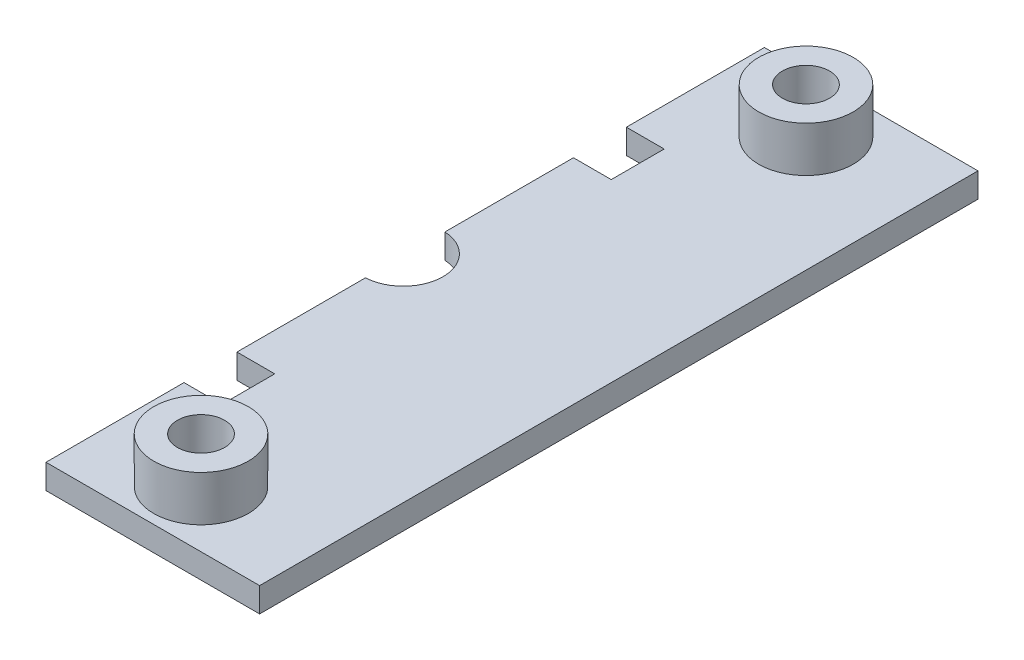
ISO-10303-21;
HEADER;
FILE_DESCRIPTION(('STEP AP214'),'2;1');
FILE_NAME('part.step','',(''),(''),'','','');
FILE_SCHEMA(('AUTOMOTIVE_DESIGN { 1 0 10303 214 1 1 1 1 }'));
ENDSEC;
DATA;
#1=APPLICATION_CONTEXT('core data for automotive mechanical design processes');
#2=APPLICATION_PROTOCOL_DEFINITION('international standard','automotive_design',2000,#1);
#3=PRODUCT_CONTEXT('',#1,'mechanical');
#4=PRODUCT('Part','Part','',(#3));
#5=PRODUCT_RELATED_PRODUCT_CATEGORY('part','',(#4));
#6=PRODUCT_DEFINITION_FORMATION('','',#4);
#7=PRODUCT_DEFINITION_CONTEXT('part definition',#1,'design');
#8=PRODUCT_DEFINITION('design','',#6,#7);
#9=PRODUCT_DEFINITION_SHAPE('','',#8);
#10=(LENGTH_UNIT() NAMED_UNIT(*) SI_UNIT(.MILLI.,.METRE.));
#11=(NAMED_UNIT(*) PLANE_ANGLE_UNIT() SI_UNIT($,.RADIAN.));
#12=(NAMED_UNIT(*) SI_UNIT($,.STERADIAN.) SOLID_ANGLE_UNIT());
#13=UNCERTAINTY_MEASURE_WITH_UNIT(LENGTH_MEASURE(1.E-05),#10,'distance_accuracy_value','');
#14=(GEOMETRIC_REPRESENTATION_CONTEXT(3) GLOBAL_UNCERTAINTY_ASSIGNED_CONTEXT((#13)) GLOBAL_UNIT_ASSIGNED_CONTEXT((#10,
#11,#12)) REPRESENTATION_CONTEXT('',''));
#15=CARTESIAN_POINT('',(0.,0.,0.));
#16=DIRECTION('',(0.,0.,1.));
#17=DIRECTION('',(1.,0.,0.));
#18=AXIS2_PLACEMENT_3D('',#15,#16,#17);
#19=CARTESIAN_POINT('',(-5.65,1.3,-19.));
#20=DIRECTION('',(1.,0.,0.));
#21=DIRECTION('',(0.,0.,-1.));
#22=AXIS2_PLACEMENT_3D('',#19,#20,#21);
#23=PLANE('',#22);
#24=DIRECTION('',(0.,0.,1.));
#25=VECTOR('',#24,1.);
#26=CARTESIAN_POINT('',(-5.65,0.,-19.));
#27=LINE('',#26,#25);
#28=CARTESIAN_POINT('',(-5.65,0.,-8.9));
#29=VERTEX_POINT('',#28);
#30=CARTESIAN_POINT('',(-5.65,0.,-2.1));
#31=VERTEX_POINT('',#30);
#32=EDGE_CURVE('E153',#29,#31,#27,.T.);
#33=ORIENTED_EDGE('',*,*,#32,.T.);
#34=DIRECTION('',(0.,1.,0.));
#35=VECTOR('',#34,1.);
#36=CARTESIAN_POINT('',(-5.65,0.,-2.1));
#37=LINE('',#36,#35);
#38=CARTESIAN_POINT('',(-5.65,1.3,-2.1));
#39=VERTEX_POINT('',#38);
#40=EDGE_CURVE('E47',#31,#39,#37,.T.);
#41=ORIENTED_EDGE('',*,*,#40,.T.);
#42=DIRECTION('',(0.,0.,1.));
#43=VECTOR('',#42,1.);
#44=CARTESIAN_POINT('',(-5.65,1.3,-19.));
#45=LINE('',#44,#43);
#46=CARTESIAN_POINT('',(-5.65,1.3,-8.9));
#47=VERTEX_POINT('',#46);
#48=EDGE_CURVE('E288',#47,#39,#45,.T.);
#49=ORIENTED_EDGE('',*,*,#48,.F.);
#50=DIRECTION('',(0.,1.,0.));
#51=VECTOR('',#50,1.);
#52=CARTESIAN_POINT('',(-5.65,0.,-8.9));
#53=LINE('',#52,#51);
#54=EDGE_CURVE('E263',#29,#47,#53,.T.);
#55=ORIENTED_EDGE('',*,*,#54,.F.);
#56=EDGE_LOOP('',(#33,#41,#49,#55));
#57=FACE_BOUND('',#56,.T.);
#58=ADVANCED_FACE('F32',(#57),#23,.F.);
#59=CARTESIAN_POINT('',(-5.65,1.3,2.1));
#60=VERTEX_POINT('',#59);
#61=CARTESIAN_POINT('',(-5.65,1.3,8.9));
#62=VERTEX_POINT('',#61);
#63=EDGE_CURVE('E147',#60,#62,#45,.T.);
#64=ORIENTED_EDGE('',*,*,#63,.F.);
#65=DIRECTION('',(0.,1.,0.));
#66=VECTOR('',#65,1.);
#67=CARTESIAN_POINT('',(-5.65,0.,2.1));
#68=LINE('',#67,#66);
#69=CARTESIAN_POINT('',(-5.65,0.,2.1));
#70=VERTEX_POINT('',#69);
#71=EDGE_CURVE('E133',#60,#70,#68,.F.);
#72=ORIENTED_EDGE('',*,*,#71,.T.);
#73=CARTESIAN_POINT('',(-5.65,0.,8.9));
#74=VERTEX_POINT('',#73);
#75=EDGE_CURVE('E145',#70,#74,#27,.T.);
#76=ORIENTED_EDGE('',*,*,#75,.T.);
#77=DIRECTION('',(0.,1.,0.));
#78=VECTOR('',#77,1.);
#79=CARTESIAN_POINT('',(-5.65,0.,8.9));
#80=LINE('',#79,#78);
#81=EDGE_CURVE('E275',#74,#62,#80,.T.);
#82=ORIENTED_EDGE('',*,*,#81,.T.);
#83=EDGE_LOOP('',(#64,#72,#76,#82));
#84=FACE_BOUND('',#83,.T.);
#85=ADVANCED_FACE('F143',(#84),#23,.F.);
#86=DIRECTION('',(0.,1.,0.));
#87=VECTOR('',#86,1.);
#88=CARTESIAN_POINT('',(-5.65,0.,11.7));
#89=LINE('',#88,#87);
#90=CARTESIAN_POINT('',(-5.65,0.,11.7));
#91=VERTEX_POINT('',#90);
#92=CARTESIAN_POINT('',(-5.65,1.3,11.7));
#93=VERTEX_POINT('',#92);
#94=EDGE_CURVE('E297',#91,#93,#89,.T.);
#95=ORIENTED_EDGE('',*,*,#94,.F.);
#96=CARTESIAN_POINT('',(-5.65,0.,19.));
#97=VERTEX_POINT('',#96);
#98=EDGE_CURVE('E154',#91,#97,#27,.T.);
#99=ORIENTED_EDGE('',*,*,#98,.T.);
#100=DIRECTION('',(0.,-1.,0.));
#101=VECTOR('',#100,1.);
#102=CARTESIAN_POINT('',(-5.65,1.3,19.));
#103=LINE('',#102,#101);
#104=CARTESIAN_POINT('',(-5.65,1.3,19.));
#105=VERTEX_POINT('',#104);
#106=EDGE_CURVE('E178',#105,#97,#103,.T.);
#107=ORIENTED_EDGE('',*,*,#106,.F.);
#108=EDGE_CURVE('E286',#93,#105,#45,.T.);
#109=ORIENTED_EDGE('',*,*,#108,.F.);
#110=EDGE_LOOP('',(#95,#99,#107,#109));
#111=FACE_BOUND('',#110,.T.);
#112=ADVANCED_FACE('F209',(#111),#23,.F.);
#113=CARTESIAN_POINT('',(0.,1.3,0.));
#114=DIRECTION('',(0.,1.,0.));
#115=DIRECTION('',(0.,0.,1.));
#116=AXIS2_PLACEMENT_3D('',#113,#114,#115);
#117=PLANE('',#116);
#118=CARTESIAN_POINT('',(-0.450000000000003,1.3,16.));
#119=DIRECTION('',(0.,1.,0.));
#120=DIRECTION('',(0.,0.,1.));
#121=AXIS2_PLACEMENT_3D('',#118,#119,#120);
#122=CIRCLE('',#121,2.5);
#123=CARTESIAN_POINT('',(-0.450000000000003,1.3,18.5));
#124=VERTEX_POINT('',#123);
#125=EDGE_CURVE('E11',#124,#124,#122,.T.);
#126=ORIENTED_EDGE('',*,*,#125,.F.);
#127=EDGE_LOOP('',(#126));
#128=FACE_BOUND('',#127,.T.);
#129=CARTESIAN_POINT('',(-0.450000000000003,1.3,-16.));
#130=DIRECTION('',(0.,1.,0.));
#131=DIRECTION('',(0.,0.,1.));
#132=AXIS2_PLACEMENT_3D('',#129,#130,#131);
#133=CIRCLE('',#132,2.5);
#134=CARTESIAN_POINT('',(-0.450000000000003,1.3,-13.5));
#135=VERTEX_POINT('',#134);
#136=EDGE_CURVE('E378',#135,#135,#133,.T.);
#137=ORIENTED_EDGE('',*,*,#136,.F.);
#138=EDGE_LOOP('',(#137));
#139=FACE_BOUND('',#138,.T.);
#140=CARTESIAN_POINT('',(-5.7525,1.3,0.));
#141=DIRECTION('',(0.,1.,0.));
#142=DIRECTION('',(0.,0.,1.));
#143=AXIS2_PLACEMENT_3D('',#140,#141,#142);
#144=CIRCLE('',#143,2.1025);
#145=EDGE_CURVE('E139',#60,#39,#144,.T.);
#146=ORIENTED_EDGE('',*,*,#145,.F.);
#147=ORIENTED_EDGE('',*,*,#63,.T.);
#148=DIRECTION('',(1.,0.,0.));
#149=VECTOR('',#148,1.);
#150=CARTESIAN_POINT('',(-5.65,1.3,8.9));
#151=LINE('',#150,#149);
#152=CARTESIAN_POINT('',(-3.65,1.3,8.9));
#153=VERTEX_POINT('',#152);
#154=EDGE_CURVE('E314',#62,#153,#151,.T.);
#155=ORIENTED_EDGE('',*,*,#154,.T.);
#156=DIRECTION('',(0.,0.,1.));
#157=VECTOR('',#156,1.);
#158=CARTESIAN_POINT('',(-3.65,1.3,11.7));
#159=LINE('',#158,#157);
#160=CARTESIAN_POINT('',(-3.65,1.3,11.7));
#161=VERTEX_POINT('',#160);
#162=EDGE_CURVE('E308',#153,#161,#159,.T.);
#163=ORIENTED_EDGE('',*,*,#162,.T.);
#164=DIRECTION('',(-1.,0.,0.));
#165=VECTOR('',#164,1.);
#166=CARTESIAN_POINT('',(-5.65,1.3,11.7));
#167=LINE('',#166,#165);
#168=EDGE_CURVE('E301',#161,#93,#167,.T.);
#169=ORIENTED_EDGE('',*,*,#168,.T.);
#170=ORIENTED_EDGE('',*,*,#108,.T.);
#171=DIRECTION('',(1.,0.,0.));
#172=VECTOR('',#171,1.);
#173=CARTESIAN_POINT('',(-5.65,1.3,19.));
#174=LINE('',#173,#172);
#175=CARTESIAN_POINT('',(5.65,1.3,19.));
#176=VERTEX_POINT('',#175);
#177=EDGE_CURVE('E179',#105,#176,#174,.T.);
#178=ORIENTED_EDGE('',*,*,#177,.T.);
#179=DIRECTION('',(0.,0.,-1.));
#180=VECTOR('',#179,1.);
#181=CARTESIAN_POINT('',(5.65,1.3,-19.));
#182=LINE('',#181,#180);
#183=CARTESIAN_POINT('',(5.65,1.3,-19.));
#184=VERTEX_POINT('',#183);
#185=EDGE_CURVE('E166',#176,#184,#182,.T.);
#186=ORIENTED_EDGE('',*,*,#185,.T.);
#187=DIRECTION('',(-1.,0.,0.));
#188=VECTOR('',#187,1.);
#189=CARTESIAN_POINT('',(-5.65,1.3,-19.));
#190=LINE('',#189,#188);
#191=CARTESIAN_POINT('',(-5.65,1.3,-19.));
#192=VERTEX_POINT('',#191);
#193=EDGE_CURVE('E173',#184,#192,#190,.T.);
#194=ORIENTED_EDGE('',*,*,#193,.T.);
#195=CARTESIAN_POINT('',(-5.65,1.3,-11.7));
#196=VERTEX_POINT('',#195);
#197=EDGE_CURVE('E256',#192,#196,#45,.T.);
#198=ORIENTED_EDGE('',*,*,#197,.T.);
#199=DIRECTION('',(-1.,0.,0.));
#200=VECTOR('',#199,1.);
#201=CARTESIAN_POINT('',(-5.65,1.3,-11.7));
#202=LINE('',#201,#200);
#203=CARTESIAN_POINT('',(-3.65,1.3,-11.7));
#204=VERTEX_POINT('',#203);
#205=EDGE_CURVE('E278',#204,#196,#202,.T.);
#206=ORIENTED_EDGE('',*,*,#205,.F.);
#207=DIRECTION('',(0.,0.,-1.));
#208=VECTOR('',#207,1.);
#209=CARTESIAN_POINT('',(-3.65,1.3,-11.7));
#210=LINE('',#209,#208);
#211=CARTESIAN_POINT('',(-3.65,1.3,-8.9));
#212=VERTEX_POINT('',#211);
#213=EDGE_CURVE('E274',#212,#204,#210,.T.);
#214=ORIENTED_EDGE('',*,*,#213,.F.);
#215=DIRECTION('',(1.,0.,0.));
#216=VECTOR('',#215,1.);
#217=CARTESIAN_POINT('',(-5.65,1.3,-8.9));
#218=LINE('',#217,#216);
#219=EDGE_CURVE('E271',#47,#212,#218,.T.);
#220=ORIENTED_EDGE('',*,*,#219,.F.);
#221=ORIENTED_EDGE('',*,*,#48,.T.);
#222=EDGE_LOOP('',(#146,#147,#155,#163,#169,#170,#178,#186,#194,#198,#206,#214,#220,#221));
#223=FACE_BOUND('',#222,.T.);
#224=ADVANCED_FACE('F194',(#128,#139,#223),#117,.T.);
#225=CARTESIAN_POINT('',(0.,0.,0.));
#226=DIRECTION('',(0.,1.,0.));
#227=DIRECTION('',(0.,0.,1.));
#228=AXIS2_PLACEMENT_3D('',#225,#226,#227);
#229=PLANE('',#228);
#230=ORIENTED_EDGE('',*,*,#75,.F.);
#231=CARTESIAN_POINT('',(-5.7525,0.,0.));
#232=DIRECTION('',(0.,1.,0.));
#233=DIRECTION('',(0.,0.,1.));
#234=AXIS2_PLACEMENT_3D('',#231,#232,#233);
#235=CIRCLE('',#234,2.1025);
#236=EDGE_CURVE('E130',#70,#31,#235,.T.);
#237=ORIENTED_EDGE('',*,*,#236,.T.);
#238=ORIENTED_EDGE('',*,*,#32,.F.);
#239=DIRECTION('',(1.,0.,0.));
#240=VECTOR('',#239,1.);
#241=CARTESIAN_POINT('',(-5.65,0.,-8.9));
#242=LINE('',#241,#240);
#243=CARTESIAN_POINT('',(-3.65,0.,-8.9));
#244=VERTEX_POINT('',#243);
#245=EDGE_CURVE('E267',#29,#244,#242,.T.);
#246=ORIENTED_EDGE('',*,*,#245,.T.);
#247=DIRECTION('',(0.,0.,-1.));
#248=VECTOR('',#247,1.);
#249=CARTESIAN_POINT('',(-3.65,0.,-11.7));
#250=LINE('',#249,#248);
#251=CARTESIAN_POINT('',(-3.65,0.,-11.7));
#252=VERTEX_POINT('',#251);
#253=EDGE_CURVE('E262',#244,#252,#250,.T.);
#254=ORIENTED_EDGE('',*,*,#253,.T.);
#255=DIRECTION('',(-1.,0.,0.));
#256=VECTOR('',#255,1.);
#257=CARTESIAN_POINT('',(-5.65,0.,-11.7));
#258=LINE('',#257,#256);
#259=CARTESIAN_POINT('',(-5.65,0.,-11.7));
#260=VERTEX_POINT('',#259);
#261=EDGE_CURVE('E260',#252,#260,#258,.T.);
#262=ORIENTED_EDGE('',*,*,#261,.T.);
#263=CARTESIAN_POINT('',(-5.65,0.,-19.));
#264=VERTEX_POINT('',#263);
#265=EDGE_CURVE('E156',#264,#260,#27,.T.);
#266=ORIENTED_EDGE('',*,*,#265,.F.);
#267=DIRECTION('',(-1.,0.,0.));
#268=VECTOR('',#267,1.);
#269=CARTESIAN_POINT('',(-5.65,0.,-19.));
#270=LINE('',#269,#268);
#271=CARTESIAN_POINT('',(5.65,0.,-19.));
#272=VERTEX_POINT('',#271);
#273=EDGE_CURVE('E157',#272,#264,#270,.T.);
#274=ORIENTED_EDGE('',*,*,#273,.F.);
#275=DIRECTION('',(0.,0.,-1.));
#276=VECTOR('',#275,1.);
#277=CARTESIAN_POINT('',(5.65,0.,-19.));
#278=LINE('',#277,#276);
#279=CARTESIAN_POINT('',(5.65,0.,19.));
#280=VERTEX_POINT('',#279);
#281=EDGE_CURVE('E254',#280,#272,#278,.T.);
#282=ORIENTED_EDGE('',*,*,#281,.F.);
#283=DIRECTION('',(1.,0.,0.));
#284=VECTOR('',#283,1.);
#285=CARTESIAN_POINT('',(-5.65,0.,19.));
#286=LINE('',#285,#284);
#287=EDGE_CURVE('E161',#97,#280,#286,.T.);
#288=ORIENTED_EDGE('',*,*,#287,.F.);
#289=ORIENTED_EDGE('',*,*,#98,.F.);
#290=DIRECTION('',(-1.,0.,0.));
#291=VECTOR('',#290,1.);
#292=CARTESIAN_POINT('',(-5.65,0.,11.7));
#293=LINE('',#292,#291);
#294=CARTESIAN_POINT('',(-3.65,0.,11.7));
#295=VERTEX_POINT('',#294);
#296=EDGE_CURVE('E293',#295,#91,#293,.T.);
#297=ORIENTED_EDGE('',*,*,#296,.F.);
#298=DIRECTION('',(0.,0.,1.));
#299=VECTOR('',#298,1.);
#300=CARTESIAN_POINT('',(-3.65,0.,11.7));
#301=LINE('',#300,#299);
#302=CARTESIAN_POINT('',(-3.65,0.,8.9));
#303=VERTEX_POINT('',#302);
#304=EDGE_CURVE('E313',#303,#295,#301,.T.);
#305=ORIENTED_EDGE('',*,*,#304,.F.);
#306=DIRECTION('',(1.,0.,0.));
#307=VECTOR('',#306,1.);
#308=CARTESIAN_POINT('',(-5.65,0.,8.9));
#309=LINE('',#308,#307);
#310=EDGE_CURVE('E152',#74,#303,#309,.T.);
#311=ORIENTED_EDGE('',*,*,#310,.F.);
#312=EDGE_LOOP('',(#230,#237,#238,#246,#254,#262,#266,#274,#282,#288,#289,#297,#305,#311));
#313=FACE_BOUND('',#312,.T.);
#314=ADVANCED_FACE('F150',(#313),#229,.F.);
#315=ORIENTED_EDGE('',*,*,#265,.T.);
#316=DIRECTION('',(0.,1.,0.));
#317=VECTOR('',#316,1.);
#318=CARTESIAN_POINT('',(-5.65,0.,-11.7));
#319=LINE('',#318,#317);
#320=EDGE_CURVE('E280',#260,#196,#319,.T.);
#321=ORIENTED_EDGE('',*,*,#320,.T.);
#322=ORIENTED_EDGE('',*,*,#197,.F.);
#323=DIRECTION('',(0.,-1.,0.));
#324=VECTOR('',#323,1.);
#325=CARTESIAN_POINT('',(-5.65,1.3,-19.));
#326=LINE('',#325,#324);
#327=EDGE_CURVE('E181',#192,#264,#326,.T.);
#328=ORIENTED_EDGE('',*,*,#327,.T.);
#329=EDGE_LOOP('',(#315,#321,#322,#328));
#330=FACE_BOUND('',#329,.T.);
#331=ADVANCED_FACE('F220',(#330),#23,.F.);
#332=CARTESIAN_POINT('',(5.65,1.3,-19.));
#333=DIRECTION('',(-1.,0.,0.));
#334=DIRECTION('',(0.,0.,1.));
#335=AXIS2_PLACEMENT_3D('',#332,#333,#334);
#336=PLANE('',#335);
#337=ORIENTED_EDGE('',*,*,#281,.T.);
#338=DIRECTION('',(0.,-1.,0.));
#339=VECTOR('',#338,1.);
#340=CARTESIAN_POINT('',(5.65,1.3,-19.));
#341=LINE('',#340,#339);
#342=EDGE_CURVE('E183',#184,#272,#341,.T.);
#343=ORIENTED_EDGE('',*,*,#342,.F.);
#344=ORIENTED_EDGE('',*,*,#185,.F.);
#345=DIRECTION('',(0.,-1.,0.));
#346=VECTOR('',#345,1.);
#347=CARTESIAN_POINT('',(5.65,1.3,19.));
#348=LINE('',#347,#346);
#349=EDGE_CURVE('E176',#176,#280,#348,.T.);
#350=ORIENTED_EDGE('',*,*,#349,.T.);
#351=EDGE_LOOP('',(#337,#343,#344,#350));
#352=FACE_BOUND('',#351,.T.);
#353=ADVANCED_FACE('F34',(#352),#336,.F.);
#354=CARTESIAN_POINT('',(-5.65,1.3,-19.));
#355=DIRECTION('',(0.,0.,1.));
#356=DIRECTION('',(1.,0.,0.));
#357=AXIS2_PLACEMENT_3D('',#354,#355,#356);
#358=PLANE('',#357);
#359=ORIENTED_EDGE('',*,*,#273,.T.);
#360=ORIENTED_EDGE('',*,*,#327,.F.);
#361=ORIENTED_EDGE('',*,*,#193,.F.);
#362=ORIENTED_EDGE('',*,*,#342,.T.);
#363=EDGE_LOOP('',(#359,#360,#361,#362));
#364=FACE_BOUND('',#363,.T.);
#365=ADVANCED_FACE('F232',(#364),#358,.F.);
#366=CARTESIAN_POINT('',(-5.65,1.3,19.));
#367=DIRECTION('',(0.,0.,-1.));
#368=DIRECTION('',(-1.,0.,0.));
#369=AXIS2_PLACEMENT_3D('',#366,#367,#368);
#370=PLANE('',#369);
#371=ORIENTED_EDGE('',*,*,#287,.T.);
#372=ORIENTED_EDGE('',*,*,#349,.F.);
#373=ORIENTED_EDGE('',*,*,#177,.F.);
#374=ORIENTED_EDGE('',*,*,#106,.T.);
#375=EDGE_LOOP('',(#371,#372,#373,#374));
#376=FACE_BOUND('',#375,.T.);
#377=ADVANCED_FACE('F236',(#376),#370,.F.);
#378=CARTESIAN_POINT('',(-5.65,0.,-11.7));
#379=DIRECTION('',(0.,0.,-1.));
#380=DIRECTION('',(-1.,0.,0.));
#381=AXIS2_PLACEMENT_3D('',#378,#379,#380);
#382=PLANE('',#381);
#383=ORIENTED_EDGE('',*,*,#205,.T.);
#384=ORIENTED_EDGE('',*,*,#320,.F.);
#385=ORIENTED_EDGE('',*,*,#261,.F.);
#386=DIRECTION('',(0.,1.,0.));
#387=VECTOR('',#386,1.);
#388=CARTESIAN_POINT('',(-3.65,0.,-11.7));
#389=LINE('',#388,#387);
#390=EDGE_CURVE('E282',#252,#204,#389,.T.);
#391=ORIENTED_EDGE('',*,*,#390,.T.);
#392=EDGE_LOOP('',(#383,#384,#385,#391));
#393=FACE_BOUND('',#392,.T.);
#394=ADVANCED_FACE('F238',(#393),#382,.F.);
#395=CARTESIAN_POINT('',(-3.65,0.,-11.7));
#396=DIRECTION('',(1.,0.,0.));
#397=DIRECTION('',(0.,0.,-1.));
#398=AXIS2_PLACEMENT_3D('',#395,#396,#397);
#399=PLANE('',#398);
#400=ORIENTED_EDGE('',*,*,#213,.T.);
#401=ORIENTED_EDGE('',*,*,#390,.F.);
#402=ORIENTED_EDGE('',*,*,#253,.F.);
#403=DIRECTION('',(0.,1.,0.));
#404=VECTOR('',#403,1.);
#405=CARTESIAN_POINT('',(-3.65,0.,-8.9));
#406=LINE('',#405,#404);
#407=EDGE_CURVE('E265',#244,#212,#406,.T.);
#408=ORIENTED_EDGE('',*,*,#407,.T.);
#409=EDGE_LOOP('',(#400,#401,#402,#408));
#410=FACE_BOUND('',#409,.T.);
#411=ADVANCED_FACE('F243',(#410),#399,.F.);
#412=CARTESIAN_POINT('',(-5.65,0.,-8.9));
#413=DIRECTION('',(0.,0.,1.));
#414=DIRECTION('',(1.,0.,0.));
#415=AXIS2_PLACEMENT_3D('',#412,#413,#414);
#416=PLANE('',#415);
#417=ORIENTED_EDGE('',*,*,#219,.T.);
#418=ORIENTED_EDGE('',*,*,#407,.F.);
#419=ORIENTED_EDGE('',*,*,#245,.F.);
#420=ORIENTED_EDGE('',*,*,#54,.T.);
#421=EDGE_LOOP('',(#417,#418,#419,#420));
#422=FACE_BOUND('',#421,.T.);
#423=ADVANCED_FACE('F326',(#422),#416,.F.);
#424=CARTESIAN_POINT('',(-5.65,0.,8.9));
#425=DIRECTION('',(0.,0.,1.));
#426=DIRECTION('',(1.,0.,0.));
#427=AXIS2_PLACEMENT_3D('',#424,#425,#426);
#428=PLANE('',#427);
#429=ORIENTED_EDGE('',*,*,#154,.F.);
#430=ORIENTED_EDGE('',*,*,#81,.F.);
#431=ORIENTED_EDGE('',*,*,#310,.T.);
#432=DIRECTION('',(0.,1.,0.));
#433=VECTOR('',#432,1.);
#434=CARTESIAN_POINT('',(-3.65,0.,8.9));
#435=LINE('',#434,#433);
#436=EDGE_CURVE('E321',#303,#153,#435,.T.);
#437=ORIENTED_EDGE('',*,*,#436,.T.);
#438=EDGE_LOOP('',(#429,#430,#431,#437));
#439=FACE_BOUND('',#438,.T.);
#440=ADVANCED_FACE('F334',(#439),#428,.T.);
#441=CARTESIAN_POINT('',(-3.65,0.,11.7));
#442=DIRECTION('',(-1.,0.,0.));
#443=DIRECTION('',(0.,0.,1.));
#444=AXIS2_PLACEMENT_3D('',#441,#442,#443);
#445=PLANE('',#444);
#446=ORIENTED_EDGE('',*,*,#162,.F.);
#447=ORIENTED_EDGE('',*,*,#436,.F.);
#448=ORIENTED_EDGE('',*,*,#304,.T.);
#449=DIRECTION('',(0.,1.,0.));
#450=VECTOR('',#449,1.);
#451=CARTESIAN_POINT('',(-3.65,0.,11.7));
#452=LINE('',#451,#450);
#453=EDGE_CURVE('E55',#295,#161,#452,.T.);
#454=ORIENTED_EDGE('',*,*,#453,.T.);
#455=EDGE_LOOP('',(#446,#447,#448,#454));
#456=FACE_BOUND('',#455,.T.);
#457=ADVANCED_FACE('F339',(#456),#445,.T.);
#458=CARTESIAN_POINT('',(-5.65,0.,11.7));
#459=DIRECTION('',(0.,0.,-1.));
#460=DIRECTION('',(-1.,0.,0.));
#461=AXIS2_PLACEMENT_3D('',#458,#459,#460);
#462=PLANE('',#461);
#463=ORIENTED_EDGE('',*,*,#168,.F.);
#464=ORIENTED_EDGE('',*,*,#453,.F.);
#465=ORIENTED_EDGE('',*,*,#296,.T.);
#466=ORIENTED_EDGE('',*,*,#94,.T.);
#467=EDGE_LOOP('',(#463,#464,#465,#466));
#468=FACE_BOUND('',#467,.T.);
#469=ADVANCED_FACE('F336',(#468),#462,.T.);
#470=CARTESIAN_POINT('',(-5.7525,0.,0.));
#471=DIRECTION('',(0.,1.,0.));
#472=DIRECTION('',(0.,0.,1.));
#473=AXIS2_PLACEMENT_3D('',#470,#471,#472);
#474=CYLINDRICAL_SURFACE('',#473,2.1025);
#475=ORIENTED_EDGE('',*,*,#236,.F.);
#476=ORIENTED_EDGE('',*,*,#71,.F.);
#477=ORIENTED_EDGE('',*,*,#145,.T.);
#478=ORIENTED_EDGE('',*,*,#40,.F.);
#479=EDGE_LOOP('',(#475,#476,#477,#478));
#480=FACE_BOUND('',#479,.T.);
#481=ADVANCED_FACE('F132',(#480),#474,.F.);
#482=CARTESIAN_POINT('',(-0.450000000000003,3.7,-16.));
#483=DIRECTION('',(0.,1.,0.));
#484=DIRECTION('',(0.,0.,1.));
#485=AXIS2_PLACEMENT_3D('',#482,#483,#484);
#486=PLANE('',#485);
#487=CARTESIAN_POINT('',(-0.450000000000003,3.7,-16.));
#488=DIRECTION('',(0.,1.,0.));
#489=DIRECTION('',(0.,0.,1.));
#490=AXIS2_PLACEMENT_3D('',#487,#488,#489);
#491=CIRCLE('',#490,2.5);
#492=CARTESIAN_POINT('',(-0.450000000000003,3.7,-13.5));
#493=VERTEX_POINT('',#492);
#494=EDGE_CURVE('E379',#493,#493,#491,.T.);
#495=ORIENTED_EDGE('',*,*,#494,.T.);
#496=EDGE_LOOP('',(#495));
#497=FACE_BOUND('',#496,.T.);
#498=CARTESIAN_POINT('',(-0.450000000000003,3.7,-16.));
#499=DIRECTION('',(0.,1.,0.));
#500=DIRECTION('',(0.,0.,1.));
#501=AXIS2_PLACEMENT_3D('',#498,#499,#500);
#502=CIRCLE('',#501,1.25);
#503=CARTESIAN_POINT('',(-0.450000000000003,3.7,-14.75));
#504=VERTEX_POINT('',#503);
#505=EDGE_CURVE('E375',#504,#504,#502,.T.);
#506=ORIENTED_EDGE('',*,*,#505,.F.);
#507=EDGE_LOOP('',(#506));
#508=FACE_BOUND('',#507,.T.);
#509=ADVANCED_FACE('F348',(#497,#508),#486,.T.);
#510=CARTESIAN_POINT('',(-0.450000000000003,3.7,-16.));
#511=DIRECTION('',(0.,-1.,0.));
#512=DIRECTION('',(0.,0.,-1.));
#513=AXIS2_PLACEMENT_3D('',#510,#511,#512);
#514=CYLINDRICAL_SURFACE('',#513,2.5);
#515=ORIENTED_EDGE('',*,*,#494,.F.);
#516=EDGE_LOOP('',(#515));
#517=FACE_BOUND('',#516,.T.);
#518=ORIENTED_EDGE('',*,*,#136,.T.);
#519=EDGE_LOOP('',(#518));
#520=FACE_BOUND('',#519,.T.);
#521=ADVANCED_FACE('F203',(#517,#520),#514,.T.);
#522=CARTESIAN_POINT('',(-0.450000000000003,3.7,-16.));
#523=DIRECTION('',(0.,-1.,0.));
#524=DIRECTION('',(0.,0.,-1.));
#525=AXIS2_PLACEMENT_3D('',#522,#523,#524);
#526=CYLINDRICAL_SURFACE('',#525,1.25);
#527=ORIENTED_EDGE('',*,*,#505,.T.);
#528=EDGE_LOOP('',(#527));
#529=FACE_BOUND('',#528,.T.);
#530=CARTESIAN_POINT('',(-0.450000000000003,1.3,-16.));
#531=DIRECTION('',(0.,1.,0.));
#532=DIRECTION('',(0.,0.,1.));
#533=AXIS2_PLACEMENT_3D('',#530,#531,#532);
#534=CIRCLE('',#533,1.25);
#535=CARTESIAN_POINT('',(-0.450000000000003,1.3,-14.75));
#536=VERTEX_POINT('',#535);
#537=EDGE_CURVE('E40',#536,#536,#534,.F.);
#538=ORIENTED_EDGE('',*,*,#537,.T.);
#539=EDGE_LOOP('',(#538));
#540=FACE_BOUND('',#539,.T.);
#541=ADVANCED_FACE('F188',(#529,#540),#526,.F.);
#542=ORIENTED_EDGE('',*,*,#537,.F.);
#543=EDGE_LOOP('',(#542));
#544=FACE_BOUND('',#543,.T.);
#545=ADVANCED_FACE('F190',(#544),#117,.T.);
#546=CARTESIAN_POINT('',(-0.450000000000003,3.7,16.));
#547=DIRECTION('',(0.,-1.,0.));
#548=DIRECTION('',(0.,0.,-1.));
#549=AXIS2_PLACEMENT_3D('',#546,#547,#548);
#550=CYLINDRICAL_SURFACE('',#549,2.5);
#551=CARTESIAN_POINT('',(-0.450000000000003,3.7,16.));
#552=DIRECTION('',(0.,-1.,0.));
#553=DIRECTION('',(0.,0.,-1.));
#554=AXIS2_PLACEMENT_3D('',#551,#552,#553);
#555=CIRCLE('',#554,2.5);
#556=CARTESIAN_POINT('',(-0.450000000000003,3.7,13.5));
#557=VERTEX_POINT('',#556);
#558=EDGE_CURVE('E370',#557,#557,#555,.T.);
#559=ORIENTED_EDGE('',*,*,#558,.T.);
#560=EDGE_LOOP('',(#559));
#561=FACE_BOUND('',#560,.T.);
#562=ORIENTED_EDGE('',*,*,#125,.T.);
#563=EDGE_LOOP('',(#562));
#564=FACE_BOUND('',#563,.T.);
#565=ADVANCED_FACE('F192',(#561,#564),#550,.T.);
#566=CARTESIAN_POINT('',(-0.450000000000003,3.7,16.));
#567=DIRECTION('',(0.,1.,0.));
#568=DIRECTION('',(0.,0.,-1.));
#569=AXIS2_PLACEMENT_3D('',#566,#567,#568);
#570=PLANE('',#569);
#571=CARTESIAN_POINT('',(-0.450000000000003,3.7,16.));
#572=DIRECTION('',(0.,-1.,0.));
#573=DIRECTION('',(0.,0.,-1.));
#574=AXIS2_PLACEMENT_3D('',#571,#572,#573);
#575=CIRCLE('',#574,1.25);
#576=CARTESIAN_POINT('',(-0.450000000000003,3.7,14.75));
#577=VERTEX_POINT('',#576);
#578=EDGE_CURVE('E365',#577,#577,#575,.T.);
#579=ORIENTED_EDGE('',*,*,#578,.T.);
#580=EDGE_LOOP('',(#579));
#581=FACE_BOUND('',#580,.T.);
#582=ORIENTED_EDGE('',*,*,#558,.F.);
#583=EDGE_LOOP('',(#582));
#584=FACE_BOUND('',#583,.T.);
#585=ADVANCED_FACE('F200',(#581,#584),#570,.T.);
#586=CARTESIAN_POINT('',(-0.450000000000003,3.7,16.));
#587=DIRECTION('',(0.,-1.,0.));
#588=DIRECTION('',(0.,0.,-1.));
#589=AXIS2_PLACEMENT_3D('',#586,#587,#588);
#590=CYLINDRICAL_SURFACE('',#589,1.25);
#591=ORIENTED_EDGE('',*,*,#578,.F.);
#592=EDGE_LOOP('',(#591));
#593=FACE_BOUND('',#592,.T.);
#594=CARTESIAN_POINT('',(-0.450000000000003,1.3,16.));
#595=DIRECTION('',(0.,-1.,0.));
#596=DIRECTION('',(0.,0.,-1.));
#597=AXIS2_PLACEMENT_3D('',#594,#595,#596);
#598=CIRCLE('',#597,1.25);
#599=CARTESIAN_POINT('',(-0.450000000000003,1.3,14.75));
#600=VERTEX_POINT('',#599);
#601=EDGE_CURVE('E368',#600,#600,#598,.T.);
#602=ORIENTED_EDGE('',*,*,#601,.T.);
#603=EDGE_LOOP('',(#602));
#604=FACE_BOUND('',#603,.T.);
#605=ADVANCED_FACE('F212',(#593,#604),#590,.F.);
#606=ORIENTED_EDGE('',*,*,#601,.F.);
#607=EDGE_LOOP('',(#606));
#608=FACE_BOUND('',#607,.T.);
#609=ADVANCED_FACE('F195',(#608),#117,.T.);
#610=CLOSED_SHELL('',(#58,#85,#112,#224,#314,#331,#353,#365,#377,#394,#411,#423,#440,#457,#469,
#481,#509,#521,#541,#545,#565,#585,#605,#609));
#611=MANIFOLD_SOLID_BREP('B2',#610);
#612=ADVANCED_BREP_SHAPE_REPRESENTATION('',(#18,#611),#14);
#613=SHAPE_DEFINITION_REPRESENTATION(#9,#612);
ENDSEC;
END-ISO-10303-21;
